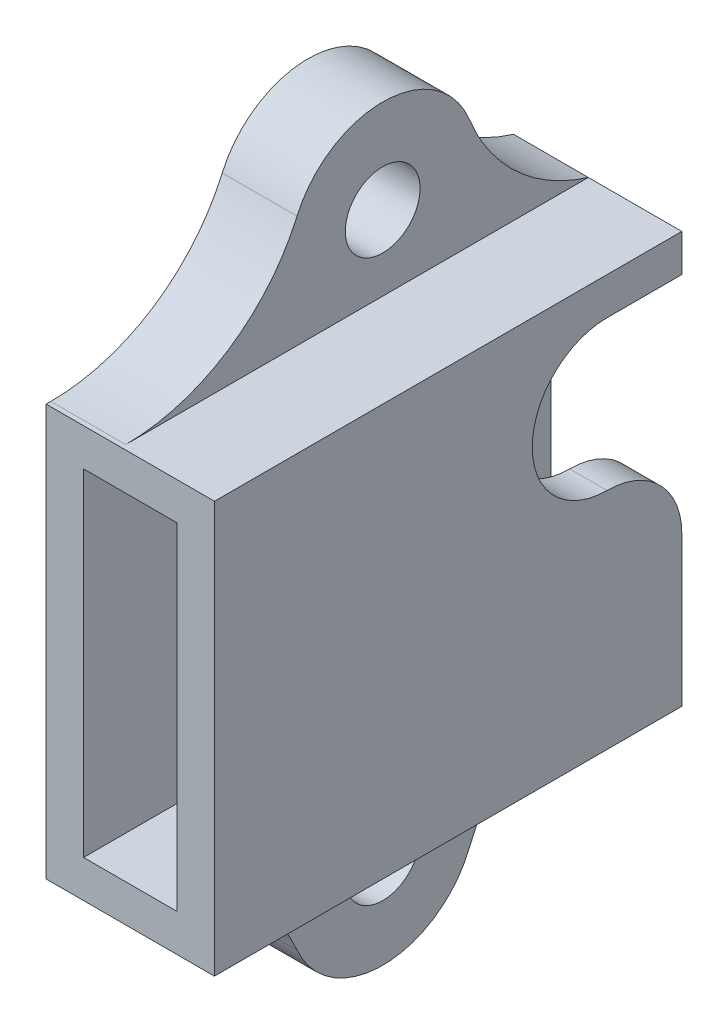
ISO-10303-21;
HEADER;
FILE_DESCRIPTION(('STEP AP214'),'2;1');
FILE_NAME('part.step','',(''),(''),'','','');
FILE_SCHEMA(('AUTOMOTIVE_DESIGN { 1 0 10303 214 1 1 1 1 }'));
ENDSEC;
DATA;
#1=APPLICATION_CONTEXT('core data for automotive mechanical design processes');
#2=APPLICATION_PROTOCOL_DEFINITION('international standard','automotive_design',2000,#1);
#3=PRODUCT_CONTEXT('',#1,'mechanical');
#4=PRODUCT('Part','Part','',(#3));
#5=PRODUCT_RELATED_PRODUCT_CATEGORY('part','',(#4));
#6=PRODUCT_DEFINITION_FORMATION('','',#4);
#7=PRODUCT_DEFINITION_CONTEXT('part definition',#1,'design');
#8=PRODUCT_DEFINITION('design','',#6,#7);
#9=PRODUCT_DEFINITION_SHAPE('','',#8);
#10=(LENGTH_UNIT() NAMED_UNIT(*) SI_UNIT(.MILLI.,.METRE.));
#11=(NAMED_UNIT(*) PLANE_ANGLE_UNIT() SI_UNIT($,.RADIAN.));
#12=(NAMED_UNIT(*) SI_UNIT($,.STERADIAN.) SOLID_ANGLE_UNIT());
#13=UNCERTAINTY_MEASURE_WITH_UNIT(LENGTH_MEASURE(1.E-05),#10,'distance_accuracy_value','');
#14=(GEOMETRIC_REPRESENTATION_CONTEXT(3) GLOBAL_UNCERTAINTY_ASSIGNED_CONTEXT((#13)) GLOBAL_UNIT_ASSIGNED_CONTEXT((#10,
#11,#12)) REPRESENTATION_CONTEXT('',''));
#15=CARTESIAN_POINT('',(0.,0.,0.));
#16=DIRECTION('',(0.,0.,1.));
#17=DIRECTION('',(1.,0.,0.));
#18=AXIS2_PLACEMENT_3D('',#15,#16,#17);
#19=CARTESIAN_POINT('',(0.,0.,0.));
#20=DIRECTION('',(0.,0.,-1.));
#21=DIRECTION('',(-1.,0.,0.));
#22=AXIS2_PLACEMENT_3D('',#19,#20,#21);
#23=PLANE('',#22);
#24=DIRECTION('',(0.,1.,0.));
#25=VECTOR('',#24,1.);
#26=CARTESIAN_POINT('',(5.,0.,0.));
#27=LINE('',#26,#25);
#28=CARTESIAN_POINT('',(5.,0.,0.));
#29=VERTEX_POINT('',#28);
#30=CARTESIAN_POINT('',(5.,6.,0.));
#31=VERTEX_POINT('',#30);
#32=EDGE_CURVE('E176',#29,#31,#27,.T.);
#33=ORIENTED_EDGE('',*,*,#32,.T.);
#34=DIRECTION('',(-1.,0.,0.));
#35=VECTOR('',#34,1.);
#36=CARTESIAN_POINT('',(0.,6.,0.));
#37=LINE('',#36,#35);
#38=CARTESIAN_POINT('',(7.,6.,0.));
#39=VERTEX_POINT('',#38);
#40=EDGE_CURVE('E249',#31,#39,#37,.F.);
#41=ORIENTED_EDGE('',*,*,#40,.T.);
#42=DIRECTION('',(0.,1.,0.));
#43=VECTOR('',#42,1.);
#44=CARTESIAN_POINT('',(7.,-2.,0.));
#45=LINE('',#44,#43);
#46=CARTESIAN_POINT('',(7.,-2.,0.));
#47=VERTEX_POINT('',#46);
#48=EDGE_CURVE('E190',#47,#39,#45,.T.);
#49=ORIENTED_EDGE('',*,*,#48,.F.);
#50=DIRECTION('',(1.,0.,0.));
#51=VECTOR('',#50,1.);
#52=CARTESIAN_POINT('',(-2.,-2.,0.));
#53=LINE('',#52,#51);
#54=CARTESIAN_POINT('',(2.,-2.,0.));
#55=VERTEX_POINT('',#54);
#56=EDGE_CURVE('E195',#55,#47,#53,.T.);
#57=ORIENTED_EDGE('',*,*,#56,.F.);
#58=CARTESIAN_POINT('',(-2.,-2.,0.));
#59=VERTEX_POINT('',#58);
#60=EDGE_CURVE('E191',#59,#55,#53,.T.);
#61=ORIENTED_EDGE('',*,*,#60,.F.);
#62=DIRECTION('',(0.,-1.,0.));
#63=VECTOR('',#62,1.);
#64=CARTESIAN_POINT('',(-2.,-2.,0.));
#65=LINE('',#64,#63);
#66=CARTESIAN_POINT('',(-2.,20.,0.));
#67=VERTEX_POINT('',#66);
#68=EDGE_CURVE('E301',#67,#59,#65,.T.);
#69=ORIENTED_EDGE('',*,*,#68,.F.);
#70=DIRECTION('',(-1.,0.,0.));
#71=VECTOR('',#70,1.);
#72=CARTESIAN_POINT('',(-2.,20.,0.));
#73=LINE('',#72,#71);
#74=CARTESIAN_POINT('',(2.,20.,0.));
#75=VERTEX_POINT('',#74);
#76=EDGE_CURVE('E193',#75,#67,#73,.T.);
#77=ORIENTED_EDGE('',*,*,#76,.F.);
#78=CARTESIAN_POINT('',(7.,20.,0.));
#79=VERTEX_POINT('',#78);
#80=EDGE_CURVE('E189',#79,#75,#73,.T.);
#81=ORIENTED_EDGE('',*,*,#80,.F.);
#82=CARTESIAN_POINT('',(7.,18.,0.));
#83=VERTEX_POINT('',#82);
#84=EDGE_CURVE('E181',#83,#79,#45,.T.);
#85=ORIENTED_EDGE('',*,*,#84,.F.);
#86=DIRECTION('',(-1.,0.,0.));
#87=VECTOR('',#86,1.);
#88=CARTESIAN_POINT('',(0.,18.,0.));
#89=LINE('',#88,#87);
#90=CARTESIAN_POINT('',(0.,18.,0.));
#91=VERTEX_POINT('',#90);
#92=EDGE_CURVE('E164',#83,#91,#89,.T.);
#93=ORIENTED_EDGE('',*,*,#92,.T.);
#94=DIRECTION('',(0.,-1.,0.));
#95=VECTOR('',#94,1.);
#96=CARTESIAN_POINT('',(0.,0.,0.));
#97=LINE('',#96,#95);
#98=CARTESIAN_POINT('',(0.,0.,0.));
#99=VERTEX_POINT('',#98);
#100=EDGE_CURVE('E290',#91,#99,#97,.T.);
#101=ORIENTED_EDGE('',*,*,#100,.T.);
#102=DIRECTION('',(1.,0.,0.));
#103=VECTOR('',#102,1.);
#104=CARTESIAN_POINT('',(0.,0.,0.));
#105=LINE('',#104,#103);
#106=EDGE_CURVE('E292',#99,#29,#105,.T.);
#107=ORIENTED_EDGE('',*,*,#106,.T.);
#108=EDGE_LOOP('',(#33,#41,#49,#57,#61,#69,#77,#81,#85,#93,#101,#107));
#109=FACE_BOUND('',#108,.T.);
#110=ADVANCED_FACE('F33',(#109),#23,.T.);
#111=CARTESIAN_POINT('',(7.,-2.,25.));
#112=DIRECTION('',(-1.,0.,0.));
#113=DIRECTION('',(0.,0.,1.));
#114=AXIS2_PLACEMENT_3D('',#111,#112,#113);
#115=PLANE('',#114);
#116=ORIENTED_EDGE('',*,*,#48,.T.);
#117=CARTESIAN_POINT('',(7.,6.,4.));
#118=DIRECTION('',(-1.,0.,0.));
#119=DIRECTION('',(0.,0.,1.));
#120=AXIS2_PLACEMENT_3D('',#117,#118,#119);
#121=CIRCLE('',#120,4.);
#122=CARTESIAN_POINT('',(7.,10.,4.));
#123=VERTEX_POINT('',#122);
#124=EDGE_CURVE('E252',#39,#123,#121,.F.);
#125=ORIENTED_EDGE('',*,*,#124,.T.);
#126=CARTESIAN_POINT('',(7.,14.,4.));
#127=DIRECTION('',(-1.,0.,0.));
#128=DIRECTION('',(0.,0.,1.));
#129=AXIS2_PLACEMENT_3D('',#126,#127,#128);
#130=CIRCLE('',#129,4.);
#131=CARTESIAN_POINT('',(7.,14.,8.));
#132=VERTEX_POINT('',#131);
#133=EDGE_CURVE('E49',#123,#132,#130,.T.);
#134=ORIENTED_EDGE('',*,*,#133,.T.);
#135=CARTESIAN_POINT('',(7.,14.,4.));
#136=DIRECTION('',(-1.,0.,0.));
#137=DIRECTION('',(0.,0.,1.));
#138=AXIS2_PLACEMENT_3D('',#135,#136,#137);
#139=CIRCLE('',#138,4.);
#140=CARTESIAN_POINT('',(7.,18.,4.));
#141=VERTEX_POINT('',#140);
#142=EDGE_CURVE('E11',#132,#141,#139,.T.);
#143=ORIENTED_EDGE('',*,*,#142,.T.);
#144=DIRECTION('',(0.,0.,1.));
#145=VECTOR('',#144,1.);
#146=CARTESIAN_POINT('',(7.,18.,0.));
#147=LINE('',#146,#145);
#148=EDGE_CURVE('E168',#83,#141,#147,.T.);
#149=ORIENTED_EDGE('',*,*,#148,.F.);
#150=ORIENTED_EDGE('',*,*,#84,.T.);
#151=DIRECTION('',(0.,0.,-1.));
#152=VECTOR('',#151,1.);
#153=CARTESIAN_POINT('',(7.,20.,25.));
#154=LINE('',#153,#152);
#155=CARTESIAN_POINT('',(7.,20.,25.));
#156=VERTEX_POINT('',#155);
#157=EDGE_CURVE('E204',#156,#79,#154,.T.);
#158=ORIENTED_EDGE('',*,*,#157,.F.);
#159=DIRECTION('',(0.,1.,0.));
#160=VECTOR('',#159,1.);
#161=CARTESIAN_POINT('',(7.,-2.,25.));
#162=LINE('',#161,#160);
#163=CARTESIAN_POINT('',(7.,-2.,25.));
#164=VERTEX_POINT('',#163);
#165=EDGE_CURVE('E306',#164,#156,#162,.T.);
#166=ORIENTED_EDGE('',*,*,#165,.F.);
#167=DIRECTION('',(0.,0.,-1.));
#168=VECTOR('',#167,1.);
#169=CARTESIAN_POINT('',(7.,-2.,25.));
#170=LINE('',#169,#168);
#171=EDGE_CURVE('E207',#164,#47,#170,.T.);
#172=ORIENTED_EDGE('',*,*,#171,.T.);
#173=EDGE_LOOP('',(#116,#125,#134,#143,#149,#150,#158,#166,#172));
#174=FACE_BOUND('',#173,.T.);
#175=ADVANCED_FACE('F179',(#174),#115,.F.);
#176=CARTESIAN_POINT('',(5.,0.,25.));
#177=DIRECTION('',(-1.,0.,0.));
#178=DIRECTION('',(0.,0.,1.));
#179=AXIS2_PLACEMENT_3D('',#176,#177,#178);
#180=PLANE('',#179);
#181=DIRECTION('',(0.,0.,-1.));
#182=VECTOR('',#181,1.);
#183=CARTESIAN_POINT('',(5.,18.,25.));
#184=LINE('',#183,#182);
#185=CARTESIAN_POINT('',(5.,18.,25.));
#186=VERTEX_POINT('',#185);
#187=CARTESIAN_POINT('',(5.,18.,4.));
#188=VERTEX_POINT('',#187);
#189=EDGE_CURVE('E269',#186,#188,#184,.T.);
#190=ORIENTED_EDGE('',*,*,#189,.T.);
#191=CARTESIAN_POINT('',(5.,14.,4.));
#192=DIRECTION('',(-1.,0.,0.));
#193=DIRECTION('',(0.,0.,1.));
#194=AXIS2_PLACEMENT_3D('',#191,#192,#193);
#195=CIRCLE('',#194,4.);
#196=CARTESIAN_POINT('',(5.,14.,8.));
#197=VERTEX_POINT('',#196);
#198=EDGE_CURVE('E42',#188,#197,#195,.F.);
#199=ORIENTED_EDGE('',*,*,#198,.T.);
#200=CARTESIAN_POINT('',(5.,14.,4.));
#201=DIRECTION('',(-1.,0.,0.));
#202=DIRECTION('',(0.,0.,1.));
#203=AXIS2_PLACEMENT_3D('',#200,#201,#202);
#204=CIRCLE('',#203,4.);
#205=CARTESIAN_POINT('',(5.,10.,4.));
#206=VERTEX_POINT('',#205);
#207=EDGE_CURVE('E256',#197,#206,#204,.F.);
#208=ORIENTED_EDGE('',*,*,#207,.T.);
#209=CARTESIAN_POINT('',(5.,6.,4.));
#210=DIRECTION('',(-1.,0.,0.));
#211=DIRECTION('',(0.,0.,1.));
#212=AXIS2_PLACEMENT_3D('',#209,#210,#211);
#213=CIRCLE('',#212,4.);
#214=EDGE_CURVE('E247',#206,#31,#213,.T.);
#215=ORIENTED_EDGE('',*,*,#214,.T.);
#216=ORIENTED_EDGE('',*,*,#32,.F.);
#217=DIRECTION('',(0.,0.,-1.));
#218=VECTOR('',#217,1.);
#219=CARTESIAN_POINT('',(5.,0.,25.));
#220=LINE('',#219,#218);
#221=CARTESIAN_POINT('',(5.,0.,25.));
#222=VERTEX_POINT('',#221);
#223=EDGE_CURVE('E273',#222,#29,#220,.T.);
#224=ORIENTED_EDGE('',*,*,#223,.F.);
#225=DIRECTION('',(0.,1.,0.));
#226=VECTOR('',#225,1.);
#227=CARTESIAN_POINT('',(5.,0.,25.));
#228=LINE('',#227,#226);
#229=EDGE_CURVE('E277',#222,#186,#228,.T.);
#230=ORIENTED_EDGE('',*,*,#229,.T.);
#231=EDGE_LOOP('',(#190,#199,#208,#215,#216,#224,#230));
#232=FACE_BOUND('',#231,.T.);
#233=ADVANCED_FACE('F278',(#232),#180,.T.);
#234=CARTESIAN_POINT('',(-2.,-2.,25.));
#235=DIRECTION('',(0.,1.,0.));
#236=DIRECTION('',(-1.,0.,0.));
#237=AXIS2_PLACEMENT_3D('',#234,#235,#236);
#238=PLANE('',#237);
#239=DIRECTION('',(0.,0.,-1.));
#240=VECTOR('',#239,1.);
#241=CARTESIAN_POINT('',(-2.,-2.,25.));
#242=LINE('',#241,#240);
#243=CARTESIAN_POINT('',(-2.,-2.,25.));
#244=VERTEX_POINT('',#243);
#245=CARTESIAN_POINT('',(-2.,-2.,24.7477270848675));
#246=VERTEX_POINT('',#245);
#247=EDGE_CURVE('E210',#244,#246,#242,.T.);
#248=ORIENTED_EDGE('',*,*,#247,.T.);
#249=DIRECTION('',(-1.,0.,0.));
#250=VECTOR('',#249,1.);
#251=CARTESIAN_POINT('',(-2.,-2.,24.7477270848675));
#252=LINE('',#251,#250);
#253=CARTESIAN_POINT('',(2.,-2.,24.7477270848675));
#254=VERTEX_POINT('',#253);
#255=EDGE_CURVE('E218',#246,#254,#252,.F.);
#256=ORIENTED_EDGE('',*,*,#255,.T.);
#257=DIRECTION('',(0.,0.,-1.));
#258=VECTOR('',#257,1.);
#259=CARTESIAN_POINT('',(2.,-2.,16.));
#260=LINE('',#259,#258);
#261=EDGE_CURVE('E316',#254,#55,#260,.T.);
#262=ORIENTED_EDGE('',*,*,#261,.T.);
#263=ORIENTED_EDGE('',*,*,#56,.T.);
#264=ORIENTED_EDGE('',*,*,#171,.F.);
#265=DIRECTION('',(1.,0.,0.));
#266=VECTOR('',#265,1.);
#267=CARTESIAN_POINT('',(-2.,-2.,25.));
#268=LINE('',#267,#266);
#269=EDGE_CURVE('E304',#244,#164,#268,.T.);
#270=ORIENTED_EDGE('',*,*,#269,.F.);
#271=EDGE_LOOP('',(#248,#256,#262,#263,#264,#270));
#272=FACE_BOUND('',#271,.T.);
#273=ADVANCED_FACE('F314',(#272),#238,.F.);
#274=CARTESIAN_POINT('',(-2.,20.,25.));
#275=DIRECTION('',(0.,-1.,0.));
#276=DIRECTION('',(0.,0.,-1.));
#277=AXIS2_PLACEMENT_3D('',#274,#275,#276);
#278=PLANE('',#277);
#279=DIRECTION('',(0.,0.,1.));
#280=VECTOR('',#279,1.);
#281=CARTESIAN_POINT('',(2.,20.,6.));
#282=LINE('',#281,#280);
#283=CARTESIAN_POINT('',(2.,20.,24.7477270848675));
#284=VERTEX_POINT('',#283);
#285=EDGE_CURVE('E293',#75,#284,#282,.T.);
#286=ORIENTED_EDGE('',*,*,#285,.T.);
#287=DIRECTION('',(-1.,0.,0.));
#288=VECTOR('',#287,1.);
#289=CARTESIAN_POINT('',(-2.,20.,24.7477270848675));
#290=LINE('',#289,#288);
#291=CARTESIAN_POINT('',(-2.,20.,24.7477270848675));
#292=VERTEX_POINT('',#291);
#293=EDGE_CURVE('E221',#284,#292,#290,.T.);
#294=ORIENTED_EDGE('',*,*,#293,.T.);
#295=DIRECTION('',(0.,0.,-1.));
#296=VECTOR('',#295,1.);
#297=CARTESIAN_POINT('',(-2.,20.,25.));
#298=LINE('',#297,#296);
#299=CARTESIAN_POINT('',(-2.,20.,25.));
#300=VERTEX_POINT('',#299);
#301=EDGE_CURVE('E201',#300,#292,#298,.T.);
#302=ORIENTED_EDGE('',*,*,#301,.F.);
#303=DIRECTION('',(-1.,0.,0.));
#304=VECTOR('',#303,1.);
#305=CARTESIAN_POINT('',(-2.,20.,25.));
#306=LINE('',#305,#304);
#307=EDGE_CURVE('E205',#156,#300,#306,.T.);
#308=ORIENTED_EDGE('',*,*,#307,.F.);
#309=ORIENTED_EDGE('',*,*,#157,.T.);
#310=ORIENTED_EDGE('',*,*,#80,.T.);
#311=EDGE_LOOP('',(#286,#294,#302,#308,#309,#310));
#312=FACE_BOUND('',#311,.T.);
#313=ADVANCED_FACE('F374',(#312),#278,.F.);
#314=CARTESIAN_POINT('',(0.,0.,25.));
#315=DIRECTION('',(0.,0.,-1.));
#316=DIRECTION('',(-1.,0.,0.));
#317=AXIS2_PLACEMENT_3D('',#314,#315,#316);
#318=PLANE('',#317);
#319=DIRECTION('',(0.,-1.,0.));
#320=VECTOR('',#319,1.);
#321=CARTESIAN_POINT('',(-2.,-2.,25.));
#322=LINE('',#321,#320);
#323=EDGE_CURVE('E200',#300,#244,#322,.T.);
#324=ORIENTED_EDGE('',*,*,#323,.T.);
#325=ORIENTED_EDGE('',*,*,#269,.T.);
#326=ORIENTED_EDGE('',*,*,#165,.T.);
#327=ORIENTED_EDGE('',*,*,#307,.T.);
#328=EDGE_LOOP('',(#324,#325,#326,#327));
#329=FACE_BOUND('',#328,.T.);
#330=DIRECTION('',(0.,-1.,0.));
#331=VECTOR('',#330,1.);
#332=CARTESIAN_POINT('',(0.,0.,25.));
#333=LINE('',#332,#331);
#334=CARTESIAN_POINT('',(0.,18.,25.));
#335=VERTEX_POINT('',#334);
#336=CARTESIAN_POINT('',(0.,0.,25.));
#337=VERTEX_POINT('',#336);
#338=EDGE_CURVE('E175',#335,#337,#333,.T.);
#339=ORIENTED_EDGE('',*,*,#338,.F.);
#340=DIRECTION('',(-1.,0.,0.));
#341=VECTOR('',#340,1.);
#342=CARTESIAN_POINT('',(0.,18.,25.));
#343=LINE('',#342,#341);
#344=EDGE_CURVE('E272',#186,#335,#343,.T.);
#345=ORIENTED_EDGE('',*,*,#344,.F.);
#346=ORIENTED_EDGE('',*,*,#229,.F.);
#347=DIRECTION('',(1.,0.,0.));
#348=VECTOR('',#347,1.);
#349=CARTESIAN_POINT('',(0.,0.,25.));
#350=LINE('',#349,#348);
#351=EDGE_CURVE('E282',#337,#222,#350,.T.);
#352=ORIENTED_EDGE('',*,*,#351,.F.);
#353=EDGE_LOOP('',(#339,#345,#346,#352));
#354=FACE_BOUND('',#353,.T.);
#355=ADVANCED_FACE('F285',(#329,#354),#318,.F.);
#356=CARTESIAN_POINT('',(-2.,-2.,25.));
#357=DIRECTION('',(1.,0.,0.));
#358=DIRECTION('',(0.,0.,-1.));
#359=AXIS2_PLACEMENT_3D('',#356,#357,#358);
#360=PLANE('',#359);
#361=ORIENTED_EDGE('',*,*,#68,.T.);
#362=CARTESIAN_POINT('',(-2.,-11.5607609435461,-2.93118579765313));
#363=DIRECTION('',(1.,0.,0.));
#364=DIRECTION('',(0.,0.,-1.));
#365=AXIS2_PLACEMENT_3D('',#362,#363,#364);
#366=CIRCLE('',#365,10.);
#367=CARTESIAN_POINT('',(-2.,-7.85358698118203,6.35627140078229));
#368=VERTEX_POINT('',#367);
#369=EDGE_CURVE('E238',#59,#368,#366,.T.);
#370=ORIENTED_EDGE('',*,*,#369,.T.);
#371=CARTESIAN_POINT('',(-2.,-6.,11.));
#372=DIRECTION('',(-1.,0.,0.));
#373=DIRECTION('',(0.,0.,1.));
#374=AXIS2_PLACEMENT_3D('',#371,#372,#373);
#375=CIRCLE('',#374,5.);
#376=CARTESIAN_POINT('',(-2.,-8.,15.5825756949558));
#377=VERTEX_POINT('',#376);
#378=EDGE_CURVE('E342',#368,#377,#375,.T.);
#379=ORIENTED_EDGE('',*,*,#378,.T.);
#380=CARTESIAN_POINT('',(-2.,-12.,24.7477270848675));
#381=DIRECTION('',(1.,0.,0.));
#382=DIRECTION('',(0.,0.,-1.));
#383=AXIS2_PLACEMENT_3D('',#380,#381,#382);
#384=CIRCLE('',#383,10.);
#385=EDGE_CURVE('E229',#377,#246,#384,.T.);
#386=ORIENTED_EDGE('',*,*,#385,.T.);
#387=ORIENTED_EDGE('',*,*,#247,.F.);
#388=ORIENTED_EDGE('',*,*,#323,.F.);
#389=ORIENTED_EDGE('',*,*,#301,.T.);
#390=CARTESIAN_POINT('',(-2.,30.,24.7477270848675));
#391=DIRECTION('',(1.,0.,0.));
#392=DIRECTION('',(0.,0.,-1.));
#393=AXIS2_PLACEMENT_3D('',#390,#391,#392);
#394=CIRCLE('',#393,10.);
#395=CARTESIAN_POINT('',(-2.,26.,15.5825756949558));
#396=VERTEX_POINT('',#395);
#397=EDGE_CURVE('E233',#292,#396,#394,.T.);
#398=ORIENTED_EDGE('',*,*,#397,.T.);
#399=CARTESIAN_POINT('',(-2.,24.,11.));
#400=DIRECTION('',(-1.,0.,0.));
#401=DIRECTION('',(0.,0.,-1.));
#402=AXIS2_PLACEMENT_3D('',#399,#400,#401);
#403=CIRCLE('',#402,5.);
#404=CARTESIAN_POINT('',(-2.,25.853586981182,6.35627140078229));
#405=VERTEX_POINT('',#404);
#406=EDGE_CURVE('E329',#396,#405,#403,.T.);
#407=ORIENTED_EDGE('',*,*,#406,.T.);
#408=CARTESIAN_POINT('',(-2.,29.5607609435461,-2.93118579765313));
#409=DIRECTION('',(1.,0.,0.));
#410=DIRECTION('',(0.,0.,-1.));
#411=AXIS2_PLACEMENT_3D('',#408,#409,#410);
#412=CIRCLE('',#411,10.);
#413=EDGE_CURVE('E243',#405,#67,#412,.T.);
#414=ORIENTED_EDGE('',*,*,#413,.T.);
#415=EDGE_LOOP('',(#361,#370,#379,#386,#387,#388,#389,#398,#407,#414));
#416=FACE_BOUND('',#415,.T.);
#417=CARTESIAN_POINT('',(-2.,24.,11.));
#418=DIRECTION('',(-1.,0.,0.));
#419=DIRECTION('',(0.,0.,1.));
#420=AXIS2_PLACEMENT_3D('',#417,#418,#419);
#421=CIRCLE('',#420,2.);
#422=CARTESIAN_POINT('',(-2.,24.,13.));
#423=VERTEX_POINT('',#422);
#424=EDGE_CURVE('E337',#423,#423,#421,.T.);
#425=ORIENTED_EDGE('',*,*,#424,.F.);
#426=EDGE_LOOP('',(#425));
#427=FACE_BOUND('',#426,.T.);
#428=CARTESIAN_POINT('',(-2.,-6.,11.));
#429=DIRECTION('',(-1.,0.,0.));
#430=DIRECTION('',(0.,0.,1.));
#431=AXIS2_PLACEMENT_3D('',#428,#429,#430);
#432=CIRCLE('',#431,2.);
#433=CARTESIAN_POINT('',(-2.,-6.,13.));
#434=VERTEX_POINT('',#433);
#435=EDGE_CURVE('E183',#434,#434,#432,.T.);
#436=ORIENTED_EDGE('',*,*,#435,.F.);
#437=EDGE_LOOP('',(#436));
#438=FACE_BOUND('',#437,.T.);
#439=ADVANCED_FACE('F365',(#416,#427,#438),#360,.F.);
#440=CARTESIAN_POINT('',(0.,0.,25.));
#441=DIRECTION('',(1.,0.,0.));
#442=DIRECTION('',(0.,0.,-1.));
#443=AXIS2_PLACEMENT_3D('',#440,#441,#442);
#444=PLANE('',#443);
#445=ORIENTED_EDGE('',*,*,#100,.F.);
#446=DIRECTION('',(0.,0.,-1.));
#447=VECTOR('',#446,1.);
#448=CARTESIAN_POINT('',(0.,18.,25.));
#449=LINE('',#448,#447);
#450=EDGE_CURVE('E171',#335,#91,#449,.T.);
#451=ORIENTED_EDGE('',*,*,#450,.F.);
#452=ORIENTED_EDGE('',*,*,#338,.T.);
#453=DIRECTION('',(0.,0.,-1.));
#454=VECTOR('',#453,1.);
#455=CARTESIAN_POINT('',(0.,0.,25.));
#456=LINE('',#455,#454);
#457=EDGE_CURVE('E298',#337,#99,#456,.T.);
#458=ORIENTED_EDGE('',*,*,#457,.T.);
#459=EDGE_LOOP('',(#445,#451,#452,#458));
#460=FACE_BOUND('',#459,.T.);
#461=ADVANCED_FACE('F326',(#460),#444,.T.);
#462=CARTESIAN_POINT('',(0.,0.,25.));
#463=DIRECTION('',(0.,1.,0.));
#464=DIRECTION('',(0.,0.,1.));
#465=AXIS2_PLACEMENT_3D('',#462,#463,#464);
#466=PLANE('',#465);
#467=ORIENTED_EDGE('',*,*,#106,.F.);
#468=ORIENTED_EDGE('',*,*,#457,.F.);
#469=ORIENTED_EDGE('',*,*,#351,.T.);
#470=ORIENTED_EDGE('',*,*,#223,.T.);
#471=EDGE_LOOP('',(#467,#468,#469,#470));
#472=FACE_BOUND('',#471,.T.);
#473=ADVANCED_FACE('F324',(#472),#466,.T.);
#474=CARTESIAN_POINT('',(0.,18.,25.));
#475=DIRECTION('',(0.,-1.,0.));
#476=DIRECTION('',(0.,0.,-1.));
#477=AXIS2_PLACEMENT_3D('',#474,#475,#476);
#478=PLANE('',#477);
#479=ORIENTED_EDGE('',*,*,#148,.T.);
#480=DIRECTION('',(-1.,0.,0.));
#481=VECTOR('',#480,1.);
#482=CARTESIAN_POINT('',(5.,18.,4.));
#483=LINE('',#482,#481);
#484=EDGE_CURVE('E254',#141,#188,#483,.T.);
#485=ORIENTED_EDGE('',*,*,#484,.T.);
#486=ORIENTED_EDGE('',*,*,#189,.F.);
#487=ORIENTED_EDGE('',*,*,#344,.T.);
#488=ORIENTED_EDGE('',*,*,#450,.T.);
#489=ORIENTED_EDGE('',*,*,#92,.F.);
#490=EDGE_LOOP('',(#479,#485,#486,#487,#488,#489));
#491=FACE_BOUND('',#490,.T.);
#492=ADVANCED_FACE('F166',(#491),#478,.T.);
#493=CARTESIAN_POINT('',(2.,24.,11.));
#494=DIRECTION('',(-1.,0.,0.));
#495=DIRECTION('',(0.,0.,1.));
#496=AXIS2_PLACEMENT_3D('',#493,#494,#495);
#497=CYLINDRICAL_SURFACE('',#496,5.);
#498=ORIENTED_EDGE('',*,*,#406,.F.);
#499=DIRECTION('',(-1.,0.,0.));
#500=VECTOR('',#499,1.);
#501=CARTESIAN_POINT('',(2.,26.,15.5825756949558));
#502=LINE('',#501,#500);
#503=CARTESIAN_POINT('',(2.,26.,15.5825756949558));
#504=VERTEX_POINT('',#503);
#505=EDGE_CURVE('E227',#396,#504,#502,.F.);
#506=ORIENTED_EDGE('',*,*,#505,.T.);
#507=CARTESIAN_POINT('',(2.,24.,11.));
#508=DIRECTION('',(-1.,0.,0.));
#509=DIRECTION('',(0.,0.,-1.));
#510=AXIS2_PLACEMENT_3D('',#507,#508,#509);
#511=CIRCLE('',#510,5.);
#512=CARTESIAN_POINT('',(2.,25.853586981182,6.35627140078229));
#513=VERTEX_POINT('',#512);
#514=EDGE_CURVE('E332',#504,#513,#511,.T.);
#515=ORIENTED_EDGE('',*,*,#514,.T.);
#516=DIRECTION('',(-1.,0.,0.));
#517=VECTOR('',#516,1.);
#518=CARTESIAN_POINT('',(2.,25.853586981182,6.35627140078229));
#519=LINE('',#518,#517);
#520=EDGE_CURVE('E224',#513,#405,#519,.T.);
#521=ORIENTED_EDGE('',*,*,#520,.T.);
#522=EDGE_LOOP('',(#498,#506,#515,#521));
#523=FACE_BOUND('',#522,.T.);
#524=ADVANCED_FACE('F405',(#523),#497,.T.);
#525=CARTESIAN_POINT('',(2.,24.,11.));
#526=DIRECTION('',(1.,0.,0.));
#527=DIRECTION('',(0.,0.,-1.));
#528=AXIS2_PLACEMENT_3D('',#525,#526,#527);
#529=PLANE('',#528);
#530=CARTESIAN_POINT('',(2.,24.,11.));
#531=DIRECTION('',(-1.,0.,0.));
#532=DIRECTION('',(0.,0.,1.));
#533=AXIS2_PLACEMENT_3D('',#530,#531,#532);
#534=CIRCLE('',#533,2.);
#535=CARTESIAN_POINT('',(2.,24.,13.));
#536=VERTEX_POINT('',#535);
#537=EDGE_CURVE('E333',#536,#536,#534,.T.);
#538=ORIENTED_EDGE('',*,*,#537,.T.);
#539=EDGE_LOOP('',(#538));
#540=FACE_BOUND('',#539,.T.);
#541=ORIENTED_EDGE('',*,*,#514,.F.);
#542=CARTESIAN_POINT('',(2.,30.,24.7477270848675));
#543=DIRECTION('',(1.,0.,0.));
#544=DIRECTION('',(0.,0.,-1.));
#545=AXIS2_PLACEMENT_3D('',#542,#543,#544);
#546=CIRCLE('',#545,10.);
#547=EDGE_CURVE('E235',#504,#284,#546,.F.);
#548=ORIENTED_EDGE('',*,*,#547,.T.);
#549=ORIENTED_EDGE('',*,*,#285,.F.);
#550=CARTESIAN_POINT('',(2.,29.5607609435461,-2.93118579765313));
#551=DIRECTION('',(1.,0.,0.));
#552=DIRECTION('',(0.,0.,-1.));
#553=AXIS2_PLACEMENT_3D('',#550,#551,#552);
#554=CIRCLE('',#553,10.);
#555=EDGE_CURVE('E245',#75,#513,#554,.F.);
#556=ORIENTED_EDGE('',*,*,#555,.T.);
#557=EDGE_LOOP('',(#541,#548,#549,#556));
#558=FACE_BOUND('',#557,.T.);
#559=ADVANCED_FACE('F409',(#540,#558),#529,.T.);
#560=CARTESIAN_POINT('',(2.,24.,11.));
#561=DIRECTION('',(-1.,0.,0.));
#562=DIRECTION('',(0.,0.,1.));
#563=AXIS2_PLACEMENT_3D('',#560,#561,#562);
#564=CYLINDRICAL_SURFACE('',#563,2.);
#565=ORIENTED_EDGE('',*,*,#537,.F.);
#566=EDGE_LOOP('',(#565));
#567=FACE_BOUND('',#566,.T.);
#568=ORIENTED_EDGE('',*,*,#424,.T.);
#569=EDGE_LOOP('',(#568));
#570=FACE_BOUND('',#569,.T.);
#571=ADVANCED_FACE('F414',(#567,#570),#564,.F.);
#572=CARTESIAN_POINT('',(2.,-6.,11.));
#573=DIRECTION('',(-1.,0.,0.));
#574=DIRECTION('',(0.,0.,1.));
#575=AXIS2_PLACEMENT_3D('',#572,#573,#574);
#576=CYLINDRICAL_SURFACE('',#575,5.);
#577=CARTESIAN_POINT('',(2.,-6.,11.));
#578=DIRECTION('',(-1.,0.,0.));
#579=DIRECTION('',(0.,0.,1.));
#580=AXIS2_PLACEMENT_3D('',#577,#578,#579);
#581=CIRCLE('',#580,5.);
#582=CARTESIAN_POINT('',(2.,-7.85358698118203,6.35627140078229));
#583=VERTEX_POINT('',#582);
#584=CARTESIAN_POINT('',(2.,-8.,15.5825756949558));
#585=VERTEX_POINT('',#584);
#586=EDGE_CURVE('E345',#583,#585,#581,.T.);
#587=ORIENTED_EDGE('',*,*,#586,.T.);
#588=DIRECTION('',(-1.,0.,0.));
#589=VECTOR('',#588,1.);
#590=CARTESIAN_POINT('',(2.,-8.,15.5825756949558));
#591=LINE('',#590,#589);
#592=EDGE_CURVE('E215',#585,#377,#591,.T.);
#593=ORIENTED_EDGE('',*,*,#592,.T.);
#594=ORIENTED_EDGE('',*,*,#378,.F.);
#595=DIRECTION('',(-1.,0.,0.));
#596=VECTOR('',#595,1.);
#597=CARTESIAN_POINT('',(2.,-7.85358698118203,6.35627140078229));
#598=LINE('',#597,#596);
#599=EDGE_CURVE('E213',#368,#583,#598,.F.);
#600=ORIENTED_EDGE('',*,*,#599,.T.);
#601=EDGE_LOOP('',(#587,#593,#594,#600));
#602=FACE_BOUND('',#601,.T.);
#603=ADVANCED_FACE('F421',(#602),#576,.T.);
#604=CARTESIAN_POINT('',(2.,-6.,11.));
#605=DIRECTION('',(-1.,0.,0.));
#606=DIRECTION('',(0.,0.,1.));
#607=AXIS2_PLACEMENT_3D('',#604,#605,#606);
#608=PLANE('',#607);
#609=CARTESIAN_POINT('',(2.,-6.,11.));
#610=DIRECTION('',(-1.,0.,0.));
#611=DIRECTION('',(0.,0.,1.));
#612=AXIS2_PLACEMENT_3D('',#609,#610,#611);
#613=CIRCLE('',#612,2.);
#614=CARTESIAN_POINT('',(2.,-6.,13.));
#615=VERTEX_POINT('',#614);
#616=EDGE_CURVE('E346',#615,#615,#613,.T.);
#617=ORIENTED_EDGE('',*,*,#616,.T.);
#618=EDGE_LOOP('',(#617));
#619=FACE_BOUND('',#618,.T.);
#620=ORIENTED_EDGE('',*,*,#586,.F.);
#621=CARTESIAN_POINT('',(2.,-11.5607609435461,-2.93118579765313));
#622=DIRECTION('',(-1.,0.,0.));
#623=DIRECTION('',(0.,0.,1.));
#624=AXIS2_PLACEMENT_3D('',#621,#622,#623);
#625=CIRCLE('',#624,10.);
#626=EDGE_CURVE('E240',#583,#55,#625,.T.);
#627=ORIENTED_EDGE('',*,*,#626,.T.);
#628=ORIENTED_EDGE('',*,*,#261,.F.);
#629=CARTESIAN_POINT('',(2.,-12.,24.7477270848675));
#630=DIRECTION('',(-1.,0.,0.));
#631=DIRECTION('',(0.,0.,1.));
#632=AXIS2_PLACEMENT_3D('',#629,#630,#631);
#633=CIRCLE('',#632,10.);
#634=EDGE_CURVE('E231',#254,#585,#633,.T.);
#635=ORIENTED_EDGE('',*,*,#634,.T.);
#636=EDGE_LOOP('',(#620,#627,#628,#635));
#637=FACE_BOUND('',#636,.T.);
#638=ADVANCED_FACE('F355',(#619,#637),#608,.F.);
#639=CARTESIAN_POINT('',(2.,-6.,11.));
#640=DIRECTION('',(-1.,0.,0.));
#641=DIRECTION('',(0.,0.,1.));
#642=AXIS2_PLACEMENT_3D('',#639,#640,#641);
#643=CYLINDRICAL_SURFACE('',#642,2.);
#644=ORIENTED_EDGE('',*,*,#616,.F.);
#645=EDGE_LOOP('',(#644));
#646=FACE_BOUND('',#645,.T.);
#647=ORIENTED_EDGE('',*,*,#435,.T.);
#648=EDGE_LOOP('',(#647));
#649=FACE_BOUND('',#648,.T.);
#650=ADVANCED_FACE('F358',(#646,#649),#643,.F.);
#651=CARTESIAN_POINT('',(2.,-12.,24.7477270848675));
#652=DIRECTION('',(-1.,0.,0.));
#653=DIRECTION('',(0.,0.,1.));
#654=AXIS2_PLACEMENT_3D('',#651,#652,#653);
#655=CYLINDRICAL_SURFACE('',#654,10.);
#656=ORIENTED_EDGE('',*,*,#634,.F.);
#657=ORIENTED_EDGE('',*,*,#255,.F.);
#658=ORIENTED_EDGE('',*,*,#385,.F.);
#659=ORIENTED_EDGE('',*,*,#592,.F.);
#660=EDGE_LOOP('',(#656,#657,#658,#659));
#661=FACE_BOUND('',#660,.T.);
#662=ADVANCED_FACE('F361',(#661),#655,.F.);
#663=CARTESIAN_POINT('',(2.,30.,24.7477270848675));
#664=DIRECTION('',(-1.,0.,0.));
#665=DIRECTION('',(0.,0.,1.));
#666=AXIS2_PLACEMENT_3D('',#663,#664,#665);
#667=CYLINDRICAL_SURFACE('',#666,10.);
#668=ORIENTED_EDGE('',*,*,#547,.F.);
#669=ORIENTED_EDGE('',*,*,#505,.F.);
#670=ORIENTED_EDGE('',*,*,#397,.F.);
#671=ORIENTED_EDGE('',*,*,#293,.F.);
#672=EDGE_LOOP('',(#668,#669,#670,#671));
#673=FACE_BOUND('',#672,.T.);
#674=ADVANCED_FACE('F442',(#673),#667,.F.);
#675=CARTESIAN_POINT('',(2.,-11.5607609435461,-2.93118579765313));
#676=DIRECTION('',(1.,0.,0.));
#677=DIRECTION('',(0.,1.,0.));
#678=AXIS2_PLACEMENT_3D('',#675,#676,#677);
#679=CYLINDRICAL_SURFACE('',#678,10.);
#680=ORIENTED_EDGE('',*,*,#626,.F.);
#681=ORIENTED_EDGE('',*,*,#599,.F.);
#682=ORIENTED_EDGE('',*,*,#369,.F.);
#683=ORIENTED_EDGE('',*,*,#60,.T.);
#684=EDGE_LOOP('',(#680,#681,#682,#683));
#685=FACE_BOUND('',#684,.T.);
#686=ADVANCED_FACE('F449',(#685),#679,.F.);
#687=CARTESIAN_POINT('',(-2.,29.5607609435461,-2.93118579765313));
#688=DIRECTION('',(1.,0.,0.));
#689=DIRECTION('',(0.,0.,-1.));
#690=AXIS2_PLACEMENT_3D('',#687,#688,#689);
#691=CYLINDRICAL_SURFACE('',#690,10.);
#692=ORIENTED_EDGE('',*,*,#555,.F.);
#693=ORIENTED_EDGE('',*,*,#76,.T.);
#694=ORIENTED_EDGE('',*,*,#413,.F.);
#695=ORIENTED_EDGE('',*,*,#520,.F.);
#696=EDGE_LOOP('',(#692,#693,#694,#695));
#697=FACE_BOUND('',#696,.T.);
#698=ADVANCED_FACE('F457',(#697),#691,.F.);
#699=CARTESIAN_POINT('',(0.,14.,4.));
#700=DIRECTION('',(1.,0.,0.));
#701=DIRECTION('',(0.,0.,-1.));
#702=AXIS2_PLACEMENT_3D('',#699,#700,#701);
#703=CYLINDRICAL_SURFACE('',#702,4.);
#704=ORIENTED_EDGE('',*,*,#484,.F.);
#705=ORIENTED_EDGE('',*,*,#142,.F.);
#706=DIRECTION('',(-1.,0.,0.));
#707=VECTOR('',#706,1.);
#708=CARTESIAN_POINT('',(7.,14.,8.));
#709=LINE('',#708,#707);
#710=EDGE_CURVE('E37',#197,#132,#709,.F.);
#711=ORIENTED_EDGE('',*,*,#710,.F.);
#712=ORIENTED_EDGE('',*,*,#198,.F.);
#713=EDGE_LOOP('',(#704,#705,#711,#712));
#714=FACE_BOUND('',#713,.T.);
#715=ADVANCED_FACE('F35',(#714),#703,.F.);
#716=CARTESIAN_POINT('',(7.,14.,4.));
#717=DIRECTION('',(1.,0.,0.));
#718=DIRECTION('',(0.,0.,-1.));
#719=AXIS2_PLACEMENT_3D('',#716,#717,#718);
#720=CYLINDRICAL_SURFACE('',#719,4.);
#721=ORIENTED_EDGE('',*,*,#710,.T.);
#722=ORIENTED_EDGE('',*,*,#133,.F.);
#723=DIRECTION('',(-1.,0.,0.));
#724=VECTOR('',#723,1.);
#725=CARTESIAN_POINT('',(7.,10.,4.));
#726=LINE('',#725,#724);
#727=EDGE_CURVE('E259',#206,#123,#726,.F.);
#728=ORIENTED_EDGE('',*,*,#727,.F.);
#729=ORIENTED_EDGE('',*,*,#207,.F.);
#730=EDGE_LOOP('',(#721,#722,#728,#729));
#731=FACE_BOUND('',#730,.T.);
#732=ADVANCED_FACE('F267',(#731),#720,.F.);
#733=CARTESIAN_POINT('',(7.,6.,4.));
#734=DIRECTION('',(-1.,0.,0.));
#735=DIRECTION('',(0.,0.,1.));
#736=AXIS2_PLACEMENT_3D('',#733,#734,#735);
#737=CYLINDRICAL_SURFACE('',#736,4.);
#738=ORIENTED_EDGE('',*,*,#124,.F.);
#739=ORIENTED_EDGE('',*,*,#40,.F.);
#740=ORIENTED_EDGE('',*,*,#214,.F.);
#741=ORIENTED_EDGE('',*,*,#727,.T.);
#742=EDGE_LOOP('',(#738,#739,#740,#741));
#743=FACE_BOUND('',#742,.T.);
#744=ADVANCED_FACE('F320',(#743),#737,.T.);
#745=CLOSED_SHELL('',(#110,#175,#233,#273,#313,#355,#439,#461,#473,#492,#524,#559,#571,#603,
#638,#650,#662,#674,#686,#698,#715,#732,#744));
#746=MANIFOLD_SOLID_BREP('B2',#745);
#747=ADVANCED_BREP_SHAPE_REPRESENTATION('',(#18,#746),#14);
#748=SHAPE_DEFINITION_REPRESENTATION(#9,#747);
ENDSEC;
END-ISO-10303-21;
